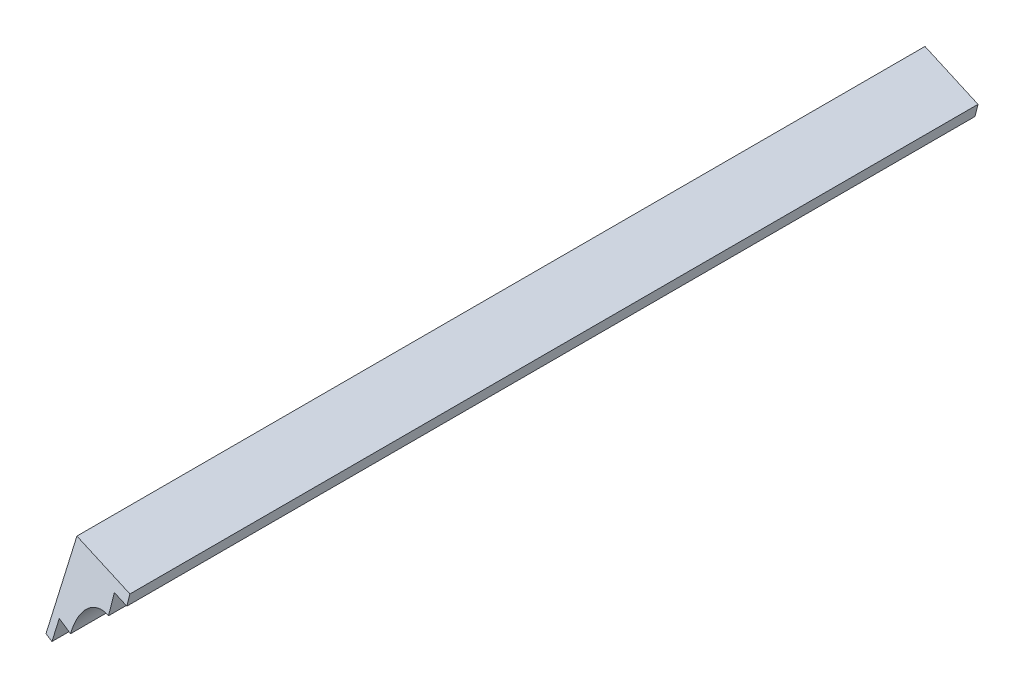
ISO-10303-21;
HEADER;
FILE_DESCRIPTION(('STEP AP214'),'2;1');
FILE_NAME('part.step','',(''),(''),'','','');
FILE_SCHEMA(('AUTOMOTIVE_DESIGN { 1 0 10303 214 1 1 1 1 }'));
ENDSEC;
DATA;
#1=APPLICATION_CONTEXT('core data for automotive mechanical design processes');
#2=APPLICATION_PROTOCOL_DEFINITION('international standard','automotive_design',2000,#1);
#3=PRODUCT_CONTEXT('',#1,'mechanical');
#4=PRODUCT('Part','Part','',(#3));
#5=PRODUCT_RELATED_PRODUCT_CATEGORY('part','',(#4));
#6=PRODUCT_DEFINITION_FORMATION('','',#4);
#7=PRODUCT_DEFINITION_CONTEXT('part definition',#1,'design');
#8=PRODUCT_DEFINITION('design','',#6,#7);
#9=PRODUCT_DEFINITION_SHAPE('','',#8);
#10=(LENGTH_UNIT() NAMED_UNIT(*) SI_UNIT(.MILLI.,.METRE.));
#11=(NAMED_UNIT(*) PLANE_ANGLE_UNIT() SI_UNIT($,.RADIAN.));
#12=(NAMED_UNIT(*) SI_UNIT($,.STERADIAN.) SOLID_ANGLE_UNIT());
#13=UNCERTAINTY_MEASURE_WITH_UNIT(LENGTH_MEASURE(1.E-05),#10,'distance_accuracy_value','');
#14=(GEOMETRIC_REPRESENTATION_CONTEXT(3) GLOBAL_UNCERTAINTY_ASSIGNED_CONTEXT((#13)) GLOBAL_UNIT_ASSIGNED_CONTEXT((#10,
#11,#12)) REPRESENTATION_CONTEXT('',''));
#15=CARTESIAN_POINT('',(0.,0.,0.));
#16=DIRECTION('',(0.,0.,1.));
#17=DIRECTION('',(1.,0.,0.));
#18=AXIS2_PLACEMENT_3D('',#15,#16,#17);
#19=CARTESIAN_POINT('',(13.4533097480271,-14.7989343137825,-40.));
#20=DIRECTION('',(0.,0.,1.));
#21=DIRECTION('',(1.,0.,0.));
#22=AXIS2_PLACEMENT_3D('',#19,#20,#21);
#23=CYLINDRICAL_SURFACE('',#22,20.);
#24=DIRECTION('',(0.,0.,1.));
#25=VECTOR('',#24,1.);
#26=CARTESIAN_POINT('',(14.4048100034042,5.17841904606015,-40.));
#27=LINE('',#26,#25);
#28=CARTESIAN_POINT('',(14.4048100034042,5.17841904606015,3.69226680369697));
#29=VERTEX_POINT('',#28);
#30=CARTESIAN_POINT('',(14.4048100034042,5.17841904606013,471.968657655179));
#31=VERTEX_POINT('',#30);
#32=EDGE_CURVE('E119',#29,#31,#27,.T.);
#33=ORIENTED_EDGE('',*,*,#32,.T.);
#34=CARTESIAN_POINT('',(13.4533097480271,-14.7989343137825,478.45013913666));
#35=DIRECTION('',(-0.280257427609222,0.308289286414952,0.90907287394995));
#36=DIRECTION('',(0.61150194783888,-0.672665487401336,0.416637144105489));
#37=AXIS2_PLACEMENT_3D('',#34,#35,#36);
#38=ELLIPSE('',#37,22.00043645907,20.);
#39=CARTESIAN_POINT('',(-6.52404361181558,-13.8474340584053,471.968657655178));
#40=VERTEX_POINT('',#39);
#41=EDGE_CURVE('E55',#31,#40,#38,.T.);
#42=ORIENTED_EDGE('',*,*,#41,.T.);
#43=DIRECTION('',(0.,0.,1.));
#44=VECTOR('',#43,1.);
#45=CARTESIAN_POINT('',(-6.52404361181558,-13.8474340584053,-40.));
#46=LINE('',#45,#44);
#47=CARTESIAN_POINT('',(-6.52404361181558,-13.8474340584053,3.69226680369689));
#48=VERTEX_POINT('',#47);
#49=EDGE_CURVE('E115',#48,#40,#46,.T.);
#50=ORIENTED_EDGE('',*,*,#49,.F.);
#51=CARTESIAN_POINT('',(13.4533097480271,-14.7989343137825,10.1737482851785));
#52=DIRECTION('',(0.280257427609221,-0.308289286414952,-0.90907287394995));
#53=DIRECTION('',(0.61150194783888,-0.672665487401337,0.416637144105489));
#54=AXIS2_PLACEMENT_3D('',#51,#52,#53);
#55=ELLIPSE('',#54,22.00043645907,20.);
#56=EDGE_CURVE('E109',#48,#29,#55,.T.);
#57=ORIENTED_EDGE('',*,*,#56,.T.);
#58=EDGE_LOOP('',(#33,#42,#50,#57));
#59=FACE_BOUND('',#58,.T.);
#60=ADVANCED_FACE('F41',(#59),#23,.F.);
#61=CARTESIAN_POINT('',(-16.010903553946,-12.9416810907585,-40.));
#62=DIRECTION('',(-0.0950422841182401,-0.995473236320087,0.));
#63=DIRECTION('',(0.995473236320087,-0.0950422841182401,0.));
#64=AXIS2_PLACEMENT_3D('',#61,#62,#63);
#65=PLANE('',#64);
#66=ORIENTED_EDGE('',*,*,#49,.T.);
#67=DIRECTION('',(-0.942738057127578,0.0900074205970784,-0.32115980427317));
#68=VECTOR('',#67,1.);
#69=CARTESIAN_POINT('',(-170.040924762827,1.76425424165648,416.263842145952));
#70=LINE('',#69,#68);
#71=CARTESIAN_POINT('',(-16.010903553946,-12.9416810907585,468.736796949921));
#72=VERTEX_POINT('',#71);
#73=EDGE_CURVE('E129',#40,#72,#70,.T.);
#74=ORIENTED_EDGE('',*,*,#73,.T.);
#75=DIRECTION('',(0.,0.,1.));
#76=VECTOR('',#75,1.);
#77=CARTESIAN_POINT('',(-16.010903553946,-12.9416810907585,-40.));
#78=LINE('',#77,#76);
#79=CARTESIAN_POINT('',(-16.010903553946,-12.9416810907585,0.460406098439228));
#80=VERTEX_POINT('',#79);
#81=EDGE_CURVE('E146',#80,#72,#78,.T.);
#82=ORIENTED_EDGE('',*,*,#81,.F.);
#83=DIRECTION('',(0.942738057127578,-0.0900074205970784,0.321159804273169));
#84=VECTOR('',#83,1.);
#85=CARTESIAN_POINT('',(-28.2610833066719,-11.7721016163147,-3.7128266484002));
#86=LINE('',#85,#84);
#87=EDGE_CURVE('E122',#80,#48,#86,.T.);
#88=ORIENTED_EDGE('',*,*,#87,.T.);
#89=EDGE_LOOP('',(#66,#74,#82,#88));
#90=FACE_BOUND('',#89,.T.);
#91=ADVANCED_FACE('F205',(#90),#65,.T.);
#92=CARTESIAN_POINT('',(-16.9613263951284,-22.8964134539594,-40.));
#93=DIRECTION('',(0.995473236320087,-0.0950422841182398,0.));
#94=DIRECTION('',(0.0950422841182398,0.995473236320087,0.));
#95=AXIS2_PLACEMENT_3D('',#92,#93,#94);
#96=PLANE('',#95);
#97=ORIENTED_EDGE('',*,*,#81,.T.);
#98=DIRECTION('',(-0.0908241663548392,-0.951292655223281,0.294606949891188));
#99=VECTOR('',#98,1.);
#100=CARTESIAN_POINT('',(-3.2663465518006,120.544856213081,427.397193000818));
#101=LINE('',#100,#99);
#102=CARTESIAN_POINT('',(-16.9613263951284,-22.8964134539594,471.81968981407));
#103=VERTEX_POINT('',#102);
#104=EDGE_CURVE('E152',#72,#103,#101,.T.);
#105=ORIENTED_EDGE('',*,*,#104,.T.);
#106=DIRECTION('',(0.,0.,1.));
#107=VECTOR('',#106,1.);
#108=CARTESIAN_POINT('',(-16.9613263951284,-22.8964134539594,-40.));
#109=LINE('',#108,#107);
#110=CARTESIAN_POINT('',(-16.9613263951284,-22.8964134539594,3.54329896258874));
#111=VERTEX_POINT('',#110);
#112=EDGE_CURVE('E143',#111,#103,#109,.T.);
#113=ORIENTED_EDGE('',*,*,#112,.F.);
#114=DIRECTION('',(0.0908241663548392,0.951292655223281,-0.294606949891188));
#115=VECTOR('',#114,1.);
#116=CARTESIAN_POINT('',(-15.7962195939007,-10.693080497085,-0.235965684511383));
#117=LINE('',#116,#115);
#118=EDGE_CURVE('E170',#111,#80,#117,.T.);
#119=ORIENTED_EDGE('',*,*,#118,.T.);
#120=EDGE_LOOP('',(#97,#105,#113,#119));
#121=FACE_BOUND('',#120,.T.);
#122=ADVANCED_FACE('F202',(#121),#96,.T.);
#123=CARTESIAN_POINT('',(-21.9386925767286,-22.4212020333682,-40.));
#124=DIRECTION('',(-0.0950422841182393,-0.995473236320087,0.));
#125=DIRECTION('',(0.995473236320087,-0.0950422841182393,0.));
#126=AXIS2_PLACEMENT_3D('',#123,#124,#125);
#127=PLANE('',#126);
#128=ORIENTED_EDGE('',*,*,#112,.T.);
#129=DIRECTION('',(-0.942738057127578,0.0900074205970776,-0.32115980427317));
#130=VECTOR('',#129,1.);
#131=CARTESIAN_POINT('',(-176.388736366718,-7.67516526574315,417.508022437174));
#132=LINE('',#131,#130);
#133=CARTESIAN_POINT('',(-21.9386925767286,-22.4212020333682,470.124065099874));
#134=VERTEX_POINT('',#133);
#135=EDGE_CURVE('E155',#103,#134,#132,.T.);
#136=ORIENTED_EDGE('',*,*,#135,.T.);
#137=DIRECTION('',(0.,0.,1.));
#138=VECTOR('',#137,1.);
#139=CARTESIAN_POINT('',(-21.9386925767286,-22.4212020333682,-40.));
#140=LINE('',#139,#138);
#141=CARTESIAN_POINT('',(-21.9386925767286,-22.4212020333682,1.84767424839277));
#142=VERTEX_POINT('',#141);
#143=EDGE_CURVE('E140',#142,#134,#140,.T.);
#144=ORIENTED_EDGE('',*,*,#143,.F.);
#145=DIRECTION('',(0.942738057127578,-0.0900074205970776,0.321159804273169));
#146=VECTOR('',#145,1.);
#147=CARTESIAN_POINT('',(-34.6088949105629,-21.2115211237142,-2.46864635717817));
#148=LINE('',#147,#146);
#149=EDGE_CURVE('E173',#142,#111,#148,.T.);
#150=ORIENTED_EDGE('',*,*,#149,.T.);
#151=EDGE_LOOP('',(#128,#136,#144,#150));
#152=FACE_BOUND('',#151,.T.);
#153=ADVANCED_FACE('F199',(#152),#127,.T.);
#154=CARTESIAN_POINT('',(-17.9163891432114,19.7084190460601,-40.));
#155=DIRECTION('',(-0.995473236320087,0.0950422841182402,0.));
#156=DIRECTION('',(-0.0950422841182402,-0.995473236320087,0.));
#157=AXIS2_PLACEMENT_3D('',#154,#155,#156);
#158=PLANE('',#157);
#159=ORIENTED_EDGE('',*,*,#143,.T.);
#160=DIRECTION('',(0.0908241663548397,0.951292655223281,-0.294606949891188));
#161=VECTOR('',#160,1.);
#162=CARTESIAN_POINT('',(-4.61588866782938,159.017910350303,413.933971339746));
#163=LINE('',#162,#161);
#164=CARTESIAN_POINT('',(-17.9163891432114,19.7084190460601,457.076892814739));
#165=VERTEX_POINT('',#164);
#166=EDGE_CURVE('E158',#134,#165,#163,.T.);
#167=ORIENTED_EDGE('',*,*,#166,.T.);
#168=DIRECTION('',(0.,0.,1.));
#169=VECTOR('',#168,1.);
#170=CARTESIAN_POINT('',(-17.9163891432114,19.7084190460601,-40.));
#171=LINE('',#170,#169);
#172=CARTESIAN_POINT('',(-17.9163891432114,19.7084190460601,-11.1994980367424));
#173=VERTEX_POINT('',#172);
#174=EDGE_CURVE('E137',#173,#165,#171,.T.);
#175=ORIENTED_EDGE('',*,*,#174,.F.);
#176=DIRECTION('',(-0.0908241663548397,-0.951292655223281,0.294606949891188));
#177=VECTOR('',#176,1.);
#178=CARTESIAN_POINT('',(-17.1457617099295,27.779973640137,-13.699187345584));
#179=LINE('',#178,#177);
#180=EDGE_CURVE('E176',#173,#142,#179,.T.);
#181=ORIENTED_EDGE('',*,*,#180,.T.);
#182=EDGE_LOOP('',(#159,#167,#175,#181));
#183=FACE_BOUND('',#182,.T.);
#184=ADVANCED_FACE('F196',(#183),#158,.T.);
#185=CARTESIAN_POINT('',(24.4048100034042,19.7084190460601,-40.));
#186=DIRECTION('',(0.,1.,0.));
#187=DIRECTION('',(-1.,0.,0.));
#188=AXIS2_PLACEMENT_3D('',#185,#186,#187);
#189=PLANE('',#188);
#190=ORIENTED_EDGE('',*,*,#174,.T.);
#191=DIRECTION('',(0.955618514406146,0.,0.294606949891189));
#192=VECTOR('',#191,1.);
#193=CARTESIAN_POINT('',(-119.211364726662,19.7084190460601,425.848737074697));
#194=LINE('',#193,#192);
#195=CARTESIAN_POINT('',(24.4048100034042,19.7084190460602,470.124065099874));
#196=VERTEX_POINT('',#195);
#197=EDGE_CURVE('E161',#165,#196,#194,.T.);
#198=ORIENTED_EDGE('',*,*,#197,.T.);
#199=DIRECTION('',(0.,0.,1.));
#200=VECTOR('',#199,1.);
#201=CARTESIAN_POINT('',(24.4048100034042,19.7084190460601,-40.));
#202=LINE('',#201,#200);
#203=CARTESIAN_POINT('',(24.4048100034042,19.7084190460601,1.84767424839279));
#204=VERTEX_POINT('',#203);
#205=EDGE_CURVE('E134',#204,#196,#202,.T.);
#206=ORIENTED_EDGE('',*,*,#205,.F.);
#207=DIRECTION('',(-0.955618514406147,0.,-0.294606949891189));
#208=VECTOR('',#207,1.);
#209=CARTESIAN_POINT('',(12.6233566118114,19.7084190460601,-1.78442161063239));
#210=LINE('',#209,#208);
#211=EDGE_CURVE('E179',#204,#173,#210,.T.);
#212=ORIENTED_EDGE('',*,*,#211,.T.);
#213=EDGE_LOOP('',(#190,#198,#206,#212));
#214=FACE_BOUND('',#213,.T.);
#215=ADVANCED_FACE('F193',(#214),#189,.T.);
#216=CARTESIAN_POINT('',(24.4048100034042,14.7084190460601,-40.));
#217=DIRECTION('',(1.,0.,0.));
#218=DIRECTION('',(0.,0.,-1.));
#219=AXIS2_PLACEMENT_3D('',#216,#217,#218);
#220=PLANE('',#219);
#221=ORIENTED_EDGE('',*,*,#205,.T.);
#222=DIRECTION('',(0.,-0.947025015572039,0.321159804273169));
#223=VECTOR('',#222,1.);
#224=CARTESIAN_POINT('',(24.4048100034042,170.37651910295,419.028754280389));
#225=LINE('',#224,#223);
#226=CARTESIAN_POINT('',(24.4048100034042,14.7084190460601,471.81968981407));
#227=VERTEX_POINT('',#226);
#228=EDGE_CURVE('E164',#196,#227,#225,.T.);
#229=ORIENTED_EDGE('',*,*,#228,.T.);
#230=DIRECTION('',(0.,0.,1.));
#231=VECTOR('',#230,1.);
#232=CARTESIAN_POINT('',(24.4048100034042,14.7084190460601,-40.));
#233=LINE('',#232,#231);
#234=CARTESIAN_POINT('',(24.4048100034042,14.7084190460601,3.54329896258884));
#235=VERTEX_POINT('',#234);
#236=EDGE_CURVE('E127',#235,#227,#233,.T.);
#237=ORIENTED_EDGE('',*,*,#236,.F.);
#238=DIRECTION('',(0.,0.947025015572039,-0.321159804273168));
#239=VECTOR('',#238,1.);
#240=CARTESIAN_POINT('',(24.4048100034042,27.9519553042641,-0.947914513963581));
#241=LINE('',#240,#239);
#242=EDGE_CURVE('E182',#235,#204,#241,.T.);
#243=ORIENTED_EDGE('',*,*,#242,.T.);
#244=EDGE_LOOP('',(#221,#229,#237,#243));
#245=FACE_BOUND('',#244,.T.);
#246=ADVANCED_FACE('F189',(#245),#220,.T.);
#247=CARTESIAN_POINT('',(14.4048100034042,14.7084190460601,-40.));
#248=DIRECTION('',(0.,-1.,0.));
#249=DIRECTION('',(0.,0.,-1.));
#250=AXIS2_PLACEMENT_3D('',#247,#248,#249);
#251=PLANE('',#250);
#252=ORIENTED_EDGE('',*,*,#236,.T.);
#253=DIRECTION('',(-0.955618514406146,0.,-0.294606949891189));
#254=VECTOR('',#253,1.);
#255=CARTESIAN_POINT('',(-128.820804549929,14.7084190460601,424.581874442931));
#256=LINE('',#255,#254);
#257=CARTESIAN_POINT('',(14.4048100034042,14.7084190460601,468.736796949921));
#258=VERTEX_POINT('',#257);
#259=EDGE_CURVE('E121',#227,#258,#256,.T.);
#260=ORIENTED_EDGE('',*,*,#259,.T.);
#261=DIRECTION('',(0.,0.,1.));
#262=VECTOR('',#261,1.);
#263=CARTESIAN_POINT('',(14.4048100034042,14.7084190460601,-40.));
#264=LINE('',#263,#262);
#265=CARTESIAN_POINT('',(14.4048100034042,14.7084190460601,0.460406098439306));
#266=VERTEX_POINT('',#265);
#267=EDGE_CURVE('E125',#266,#258,#264,.T.);
#268=ORIENTED_EDGE('',*,*,#267,.F.);
#269=DIRECTION('',(0.955618514406147,0.,0.294606949891189));
#270=VECTOR('',#269,1.);
#271=CARTESIAN_POINT('',(3.01391678854439,14.7084190460601,-3.05128424239876));
#272=LINE('',#271,#270);
#273=EDGE_CURVE('E62',#266,#235,#272,.T.);
#274=ORIENTED_EDGE('',*,*,#273,.T.);
#275=EDGE_LOOP('',(#252,#260,#268,#274));
#276=FACE_BOUND('',#275,.T.);
#277=ADVANCED_FACE('F187',(#276),#251,.T.);
#278=CARTESIAN_POINT('',(14.4048100034042,5.17841904606015,-40.));
#279=DIRECTION('',(1.,0.,0.));
#280=DIRECTION('',(0.,0.,-1.));
#281=AXIS2_PLACEMENT_3D('',#278,#279,#280);
#282=PLANE('',#281);
#283=ORIENTED_EDGE('',*,*,#267,.T.);
#284=DIRECTION('',(0.,-0.947025015572039,0.321159804273169));
#285=VECTOR('',#284,1.);
#286=CARTESIAN_POINT('',(14.4048100034042,160.891827130868,419.16235703912));
#287=LINE('',#286,#285);
#288=EDGE_CURVE('E11',#258,#31,#287,.T.);
#289=ORIENTED_EDGE('',*,*,#288,.T.);
#290=ORIENTED_EDGE('',*,*,#32,.F.);
#291=DIRECTION('',(0.,0.947025015572039,-0.321159804273168));
#292=VECTOR('',#291,1.);
#293=CARTESIAN_POINT('',(14.4048100034042,18.4672633321818,-0.814311755233166));
#294=LINE('',#293,#292);
#295=EDGE_CURVE('E48',#29,#266,#294,.T.);
#296=ORIENTED_EDGE('',*,*,#295,.T.);
#297=EDGE_LOOP('',(#283,#289,#290,#296));
#298=FACE_BOUND('',#297,.T.);
#299=ADVANCED_FACE('F124',(#298),#282,.T.);
#300=CARTESIAN_POINT('',(-105.137336562691,-166.385741634332,25.0203899263185));
#301=DIRECTION('',(0.280257427609221,-0.308289286414952,-0.90907287394995));
#302=DIRECTION('',(0.,0.947025015572039,-0.321159804273168));
#303=AXIS2_PLACEMENT_3D('',#300,#301,#302);
#304=PLANE('',#303);
#305=ORIENTED_EDGE('',*,*,#87,.F.);
#306=ORIENTED_EDGE('',*,*,#118,.F.);
#307=ORIENTED_EDGE('',*,*,#149,.F.);
#308=ORIENTED_EDGE('',*,*,#180,.F.);
#309=ORIENTED_EDGE('',*,*,#211,.F.);
#310=ORIENTED_EDGE('',*,*,#242,.F.);
#311=ORIENTED_EDGE('',*,*,#273,.F.);
#312=ORIENTED_EDGE('',*,*,#295,.F.);
#313=ORIENTED_EDGE('',*,*,#56,.F.);
#314=EDGE_LOOP('',(#305,#306,#307,#308,#309,#310,#311,#312,#313));
#315=FACE_BOUND('',#314,.T.);
#316=ADVANCED_FACE('F108',(#315),#304,.T.);
#317=CARTESIAN_POINT('',(85.2009866249293,-35.1478049241662,507.46998882556));
#318=DIRECTION('',(-0.280257427609222,0.308289286414952,0.90907287394995));
#319=DIRECTION('',(0.,-0.947025015572039,0.321159804273169));
#320=AXIS2_PLACEMENT_3D('',#317,#318,#319);
#321=PLANE('',#320);
#322=ORIENTED_EDGE('',*,*,#288,.F.);
#323=ORIENTED_EDGE('',*,*,#259,.F.);
#324=ORIENTED_EDGE('',*,*,#228,.F.);
#325=ORIENTED_EDGE('',*,*,#197,.F.);
#326=ORIENTED_EDGE('',*,*,#166,.F.);
#327=ORIENTED_EDGE('',*,*,#135,.F.);
#328=ORIENTED_EDGE('',*,*,#104,.F.);
#329=ORIENTED_EDGE('',*,*,#73,.F.);
#330=ORIENTED_EDGE('',*,*,#41,.F.);
#331=EDGE_LOOP('',(#322,#323,#324,#325,#326,#327,#328,#329,#330));
#332=FACE_BOUND('',#331,.T.);
#333=ADVANCED_FACE('F191',(#332),#321,.T.);
#334=CLOSED_SHELL('',(#60,#91,#122,#153,#184,#215,#246,#277,#299,#316,#333));
#335=MANIFOLD_SOLID_BREP('B2',#334);
#336=ADVANCED_BREP_SHAPE_REPRESENTATION('',(#18,#335),#14);
#337=SHAPE_DEFINITION_REPRESENTATION(#9,#336);
ENDSEC;
END-ISO-10303-21;
